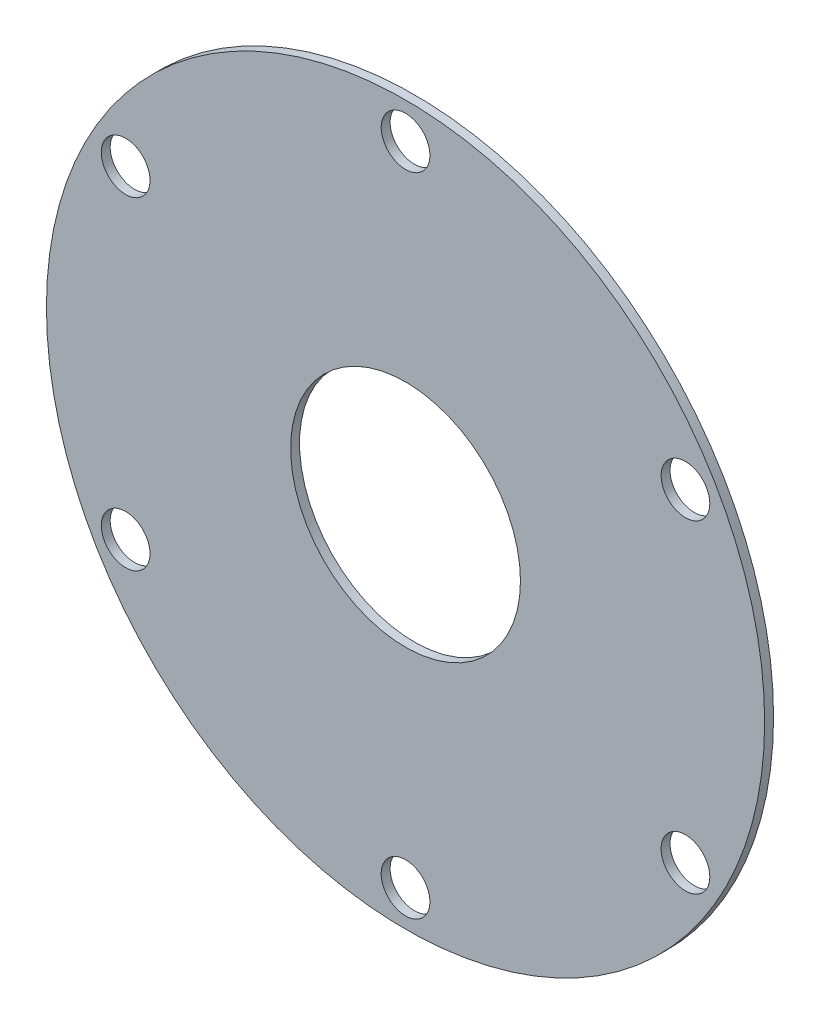
ISO-10303-21;
HEADER;
FILE_DESCRIPTION(('STEP AP214'),'2;1');
FILE_NAME('part.step','',(''),(''),'','','');
FILE_SCHEMA(('AUTOMOTIVE_DESIGN { 1 0 10303 214 1 1 1 1 }'));
ENDSEC;
DATA;
#1=APPLICATION_CONTEXT('core data for automotive mechanical design processes');
#2=APPLICATION_PROTOCOL_DEFINITION('international standard','automotive_design',2000,#1);
#3=PRODUCT_CONTEXT('',#1,'mechanical');
#4=PRODUCT('Part','Part','',(#3));
#5=PRODUCT_RELATED_PRODUCT_CATEGORY('part','',(#4));
#6=PRODUCT_DEFINITION_FORMATION('','',#4);
#7=PRODUCT_DEFINITION_CONTEXT('part definition',#1,'design');
#8=PRODUCT_DEFINITION('design','',#6,#7);
#9=PRODUCT_DEFINITION_SHAPE('','',#8);
#10=(LENGTH_UNIT() NAMED_UNIT(*) SI_UNIT(.MILLI.,.METRE.));
#11=(NAMED_UNIT(*) PLANE_ANGLE_UNIT() SI_UNIT($,.RADIAN.));
#12=(NAMED_UNIT(*) SI_UNIT($,.STERADIAN.) SOLID_ANGLE_UNIT());
#13=UNCERTAINTY_MEASURE_WITH_UNIT(LENGTH_MEASURE(1.E-05),#10,'distance_accuracy_value','');
#14=(GEOMETRIC_REPRESENTATION_CONTEXT(3) GLOBAL_UNCERTAINTY_ASSIGNED_CONTEXT((#13)) GLOBAL_UNIT_ASSIGNED_CONTEXT((#10,
#11,#12)) REPRESENTATION_CONTEXT('',''));
#15=CARTESIAN_POINT('',(0.,0.,0.));
#16=DIRECTION('',(0.,0.,1.));
#17=DIRECTION('',(1.,0.,0.));
#18=AXIS2_PLACEMENT_3D('',#15,#16,#17);
#19=CARTESIAN_POINT('',(0.,0.,0.7874));
#20=DIRECTION('',(0.,0.,1.));
#21=DIRECTION('',(1.,0.,0.));
#22=AXIS2_PLACEMENT_3D('',#19,#20,#21);
#23=PLANE('',#22);
#24=CARTESIAN_POINT('',(0.,28.575,0.787400000000001));
#25=DIRECTION('',(0.,0.,1.));
#26=DIRECTION('',(1.,0.,0.));
#27=AXIS2_PLACEMENT_3D('',#24,#25,#26);
#28=CIRCLE('',#27,2.15264999999999);
#29=CARTESIAN_POINT('',(2.15264999999999,28.575,0.787400000000001));
#30=VERTEX_POINT('',#29);
#31=EDGE_CURVE('E81',#30,#30,#28,.T.);
#32=ORIENTED_EDGE('',*,*,#31,.F.);
#33=EDGE_LOOP('',(#32));
#34=FACE_BOUND('',#33,.T.);
#35=CARTESIAN_POINT('',(24.7466759131404,14.2874999999999,0.787400000000001));
#36=DIRECTION('',(0.,0.,1.));
#37=DIRECTION('',(1.,0.,0.));
#38=AXIS2_PLACEMENT_3D('',#35,#36,#37);
#39=CIRCLE('',#38,2.15264999999999);
#40=CARTESIAN_POINT('',(26.8993259131404,14.2874999999999,0.787400000000001));
#41=VERTEX_POINT('',#40);
#42=EDGE_CURVE('E75',#41,#41,#39,.T.);
#43=ORIENTED_EDGE('',*,*,#42,.F.);
#44=EDGE_LOOP('',(#43));
#45=FACE_BOUND('',#44,.T.);
#46=CARTESIAN_POINT('',(24.7466759131403,-14.2875000000001,0.787400000000001));
#47=DIRECTION('',(0.,0.,1.));
#48=DIRECTION('',(1.,0.,0.));
#49=AXIS2_PLACEMENT_3D('',#46,#47,#48);
#50=CIRCLE('',#49,2.15264999999999);
#51=CARTESIAN_POINT('',(26.8993259131403,-14.2875000000001,0.787400000000001));
#52=VERTEX_POINT('',#51);
#53=EDGE_CURVE('E69',#52,#52,#50,.T.);
#54=ORIENTED_EDGE('',*,*,#53,.F.);
#55=EDGE_LOOP('',(#54));
#56=FACE_BOUND('',#55,.T.);
#57=CARTESIAN_POINT('',(-1.99538274087401E-13,-28.575,0.787400000000001));
#58=DIRECTION('',(0.,0.,1.));
#59=DIRECTION('',(1.,0.,0.));
#60=AXIS2_PLACEMENT_3D('',#57,#58,#59);
#61=CIRCLE('',#60,2.15264999999999);
#62=CARTESIAN_POINT('',(2.15264999999979,-28.575,0.787400000000001));
#63=VERTEX_POINT('',#62);
#64=EDGE_CURVE('E63',#63,#63,#61,.T.);
#65=ORIENTED_EDGE('',*,*,#64,.F.);
#66=EDGE_LOOP('',(#65));
#67=FACE_BOUND('',#66,.T.);
#68=CARTESIAN_POINT('',(-24.7466759131405,-14.2874999999998,0.787400000000001));
#69=DIRECTION('',(0.,0.,1.));
#70=DIRECTION('',(1.,0.,0.));
#71=AXIS2_PLACEMENT_3D('',#68,#69,#70);
#72=CIRCLE('',#71,2.15264999999999);
#73=CARTESIAN_POINT('',(-22.5940259131405,-14.2874999999998,0.787400000000001));
#74=VERTEX_POINT('',#73);
#75=EDGE_CURVE('E57',#74,#74,#72,.T.);
#76=ORIENTED_EDGE('',*,*,#75,.F.);
#77=EDGE_LOOP('',(#76));
#78=FACE_BOUND('',#77,.T.);
#79=CARTESIAN_POINT('',(-24.7466759131402,14.2875000000003,0.787400000000001));
#80=DIRECTION('',(0.,0.,1.));
#81=DIRECTION('',(1.,0.,0.));
#82=AXIS2_PLACEMENT_3D('',#79,#80,#81);
#83=CIRCLE('',#82,2.15264999999999);
#84=CARTESIAN_POINT('',(-22.5940259131402,14.2875000000003,0.787400000000001));
#85=VERTEX_POINT('',#84);
#86=EDGE_CURVE('E51',#85,#85,#83,.T.);
#87=ORIENTED_EDGE('',*,*,#86,.F.);
#88=EDGE_LOOP('',(#87));
#89=FACE_BOUND('',#88,.T.);
#90=CARTESIAN_POINT('',(0.,0.,0.7874));
#91=DIRECTION('',(0.,0.,1.));
#92=DIRECTION('',(1.,0.,0.));
#93=AXIS2_PLACEMENT_3D('',#90,#91,#92);
#94=CIRCLE('',#93,31.75);
#95=CARTESIAN_POINT('',(31.75,0.,0.7874));
#96=VERTEX_POINT('',#95);
#97=EDGE_CURVE('E10',#96,#96,#94,.T.);
#98=ORIENTED_EDGE('',*,*,#97,.T.);
#99=EDGE_LOOP('',(#98));
#100=FACE_BOUND('',#99,.T.);
#101=CARTESIAN_POINT('',(0.,0.,0.7874));
#102=DIRECTION('',(0.,0.,1.));
#103=DIRECTION('',(1.,0.,0.));
#104=AXIS2_PLACEMENT_3D('',#101,#102,#103);
#105=CIRCLE('',#104,10.16);
#106=CARTESIAN_POINT('',(10.16,0.,0.7874));
#107=VERTEX_POINT('',#106);
#108=EDGE_CURVE('E41',#107,#107,#105,.T.);
#109=ORIENTED_EDGE('',*,*,#108,.F.);
#110=EDGE_LOOP('',(#109));
#111=FACE_BOUND('',#110,.T.);
#112=ADVANCED_FACE('F30',(#34,#45,#56,#67,#78,#89,#100,#111),#23,.T.);
#113=CARTESIAN_POINT('',(0.,0.,0.));
#114=DIRECTION('',(0.,0.,1.));
#115=DIRECTION('',(1.,0.,0.));
#116=AXIS2_PLACEMENT_3D('',#113,#114,#115);
#117=PLANE('',#116);
#118=CARTESIAN_POINT('',(0.,28.575,0.));
#119=DIRECTION('',(0.,0.,1.));
#120=DIRECTION('',(1.,0.,0.));
#121=AXIS2_PLACEMENT_3D('',#118,#119,#120);
#122=CIRCLE('',#121,2.15265);
#123=CARTESIAN_POINT('',(2.15265,28.575,0.));
#124=VERTEX_POINT('',#123);
#125=EDGE_CURVE('E78',#124,#124,#122,.T.);
#126=ORIENTED_EDGE('',*,*,#125,.T.);
#127=EDGE_LOOP('',(#126));
#128=FACE_BOUND('',#127,.T.);
#129=CARTESIAN_POINT('',(24.7466759131404,14.2874999999999,0.));
#130=DIRECTION('',(0.,0.,1.));
#131=DIRECTION('',(1.,0.,0.));
#132=AXIS2_PLACEMENT_3D('',#129,#130,#131);
#133=CIRCLE('',#132,2.15265);
#134=CARTESIAN_POINT('',(26.8993259131404,14.2874999999999,0.));
#135=VERTEX_POINT('',#134);
#136=EDGE_CURVE('E72',#135,#135,#133,.T.);
#137=ORIENTED_EDGE('',*,*,#136,.T.);
#138=EDGE_LOOP('',(#137));
#139=FACE_BOUND('',#138,.T.);
#140=CARTESIAN_POINT('',(24.7466759131403,-14.2875000000001,0.));
#141=DIRECTION('',(0.,0.,1.));
#142=DIRECTION('',(1.,0.,0.));
#143=AXIS2_PLACEMENT_3D('',#140,#141,#142);
#144=CIRCLE('',#143,2.15265);
#145=CARTESIAN_POINT('',(26.8993259131403,-14.2875000000001,0.));
#146=VERTEX_POINT('',#145);
#147=EDGE_CURVE('E66',#146,#146,#144,.T.);
#148=ORIENTED_EDGE('',*,*,#147,.T.);
#149=EDGE_LOOP('',(#148));
#150=FACE_BOUND('',#149,.T.);
#151=CARTESIAN_POINT('',(-1.99538274087401E-13,-28.575,0.));
#152=DIRECTION('',(0.,0.,1.));
#153=DIRECTION('',(1.,0.,0.));
#154=AXIS2_PLACEMENT_3D('',#151,#152,#153);
#155=CIRCLE('',#154,2.15265);
#156=CARTESIAN_POINT('',(2.1526499999998,-28.575,0.));
#157=VERTEX_POINT('',#156);
#158=EDGE_CURVE('E60',#157,#157,#155,.T.);
#159=ORIENTED_EDGE('',*,*,#158,.T.);
#160=EDGE_LOOP('',(#159));
#161=FACE_BOUND('',#160,.T.);
#162=CARTESIAN_POINT('',(-24.7466759131405,-14.2874999999998,0.));
#163=DIRECTION('',(0.,0.,1.));
#164=DIRECTION('',(1.,0.,0.));
#165=AXIS2_PLACEMENT_3D('',#162,#163,#164);
#166=CIRCLE('',#165,2.15265);
#167=CARTESIAN_POINT('',(-22.5940259131405,-14.2874999999998,0.));
#168=VERTEX_POINT('',#167);
#169=EDGE_CURVE('E54',#168,#168,#166,.T.);
#170=ORIENTED_EDGE('',*,*,#169,.T.);
#171=EDGE_LOOP('',(#170));
#172=FACE_BOUND('',#171,.T.);
#173=CARTESIAN_POINT('',(-24.7466759131402,14.2875000000003,0.));
#174=DIRECTION('',(0.,0.,1.));
#175=DIRECTION('',(1.,0.,0.));
#176=AXIS2_PLACEMENT_3D('',#173,#174,#175);
#177=CIRCLE('',#176,2.15265);
#178=CARTESIAN_POINT('',(-22.5940259131402,14.2875000000003,0.));
#179=VERTEX_POINT('',#178);
#180=EDGE_CURVE('E46',#179,#179,#177,.T.);
#181=ORIENTED_EDGE('',*,*,#180,.T.);
#182=EDGE_LOOP('',(#181));
#183=FACE_BOUND('',#182,.T.);
#184=CARTESIAN_POINT('',(0.,0.,0.));
#185=DIRECTION('',(0.,0.,1.));
#186=DIRECTION('',(1.,0.,0.));
#187=AXIS2_PLACEMENT_3D('',#184,#185,#186);
#188=CIRCLE('',#187,31.75);
#189=CARTESIAN_POINT('',(31.75,0.,0.));
#190=VERTEX_POINT('',#189);
#191=EDGE_CURVE('E34',#190,#190,#188,.T.);
#192=ORIENTED_EDGE('',*,*,#191,.F.);
#193=EDGE_LOOP('',(#192));
#194=FACE_BOUND('',#193,.T.);
#195=CARTESIAN_POINT('',(0.,0.,0.));
#196=DIRECTION('',(0.,0.,1.));
#197=DIRECTION('',(1.,0.,0.));
#198=AXIS2_PLACEMENT_3D('',#195,#196,#197);
#199=CIRCLE('',#198,10.16);
#200=CARTESIAN_POINT('',(10.16,0.,0.));
#201=VERTEX_POINT('',#200);
#202=EDGE_CURVE('E43',#201,#201,#199,.T.);
#203=ORIENTED_EDGE('',*,*,#202,.T.);
#204=EDGE_LOOP('',(#203));
#205=FACE_BOUND('',#204,.T.);
#206=ADVANCED_FACE('F89',(#128,#139,#150,#161,#172,#183,#194,#205),#117,.F.);
#207=CARTESIAN_POINT('',(0.,0.,0.7874));
#208=DIRECTION('',(0.,0.,-1.));
#209=DIRECTION('',(-1.,0.,0.));
#210=AXIS2_PLACEMENT_3D('',#207,#208,#209);
#211=CYLINDRICAL_SURFACE('',#210,31.75);
#212=ORIENTED_EDGE('',*,*,#97,.F.);
#213=EDGE_LOOP('',(#212));
#214=FACE_BOUND('',#213,.T.);
#215=ORIENTED_EDGE('',*,*,#191,.T.);
#216=EDGE_LOOP('',(#215));
#217=FACE_BOUND('',#216,.T.);
#218=ADVANCED_FACE('F32',(#214,#217),#211,.T.);
#219=CARTESIAN_POINT('',(0.,0.,0.7874));
#220=DIRECTION('',(0.,0.,-1.));
#221=DIRECTION('',(-1.,0.,0.));
#222=AXIS2_PLACEMENT_3D('',#219,#220,#221);
#223=CYLINDRICAL_SURFACE('',#222,10.16);
#224=ORIENTED_EDGE('',*,*,#108,.T.);
#225=EDGE_LOOP('',(#224));
#226=FACE_BOUND('',#225,.T.);
#227=ORIENTED_EDGE('',*,*,#202,.F.);
#228=EDGE_LOOP('',(#227));
#229=FACE_BOUND('',#228,.T.);
#230=ADVANCED_FACE('F103',(#226,#229),#223,.F.);
#231=CARTESIAN_POINT('',(-24.7466759131402,14.2875000000003,0.7874));
#232=DIRECTION('',(0.,0.,1.));
#233=DIRECTION('',(1.,0.,0.));
#234=AXIS2_PLACEMENT_3D('',#231,#232,#233);
#235=CYLINDRICAL_SURFACE('',#234,2.15264999999999);
#236=ORIENTED_EDGE('',*,*,#180,.F.);
#237=EDGE_LOOP('',(#236));
#238=FACE_BOUND('',#237,.T.);
#239=ORIENTED_EDGE('',*,*,#86,.T.);
#240=EDGE_LOOP('',(#239));
#241=FACE_BOUND('',#240,.T.);
#242=ADVANCED_FACE('F106',(#238,#241),#235,.F.);
#243=CARTESIAN_POINT('',(-24.7466759131405,-14.2874999999998,0.7874));
#244=DIRECTION('',(0.,0.,1.));
#245=DIRECTION('',(1.,0.,0.));
#246=AXIS2_PLACEMENT_3D('',#243,#244,#245);
#247=CYLINDRICAL_SURFACE('',#246,2.15264999999999);
#248=ORIENTED_EDGE('',*,*,#169,.F.);
#249=EDGE_LOOP('',(#248));
#250=FACE_BOUND('',#249,.T.);
#251=ORIENTED_EDGE('',*,*,#75,.T.);
#252=EDGE_LOOP('',(#251));
#253=FACE_BOUND('',#252,.T.);
#254=ADVANCED_FACE('F120',(#250,#253),#247,.F.);
#255=CARTESIAN_POINT('',(-1.99538274087401E-13,-28.575,0.7874));
#256=DIRECTION('',(0.,0.,1.));
#257=DIRECTION('',(1.,0.,0.));
#258=AXIS2_PLACEMENT_3D('',#255,#256,#257);
#259=CYLINDRICAL_SURFACE('',#258,2.15264999999999);
#260=ORIENTED_EDGE('',*,*,#158,.F.);
#261=EDGE_LOOP('',(#260));
#262=FACE_BOUND('',#261,.T.);
#263=ORIENTED_EDGE('',*,*,#64,.T.);
#264=EDGE_LOOP('',(#263));
#265=FACE_BOUND('',#264,.T.);
#266=ADVANCED_FACE('F124',(#262,#265),#259,.F.);
#267=CARTESIAN_POINT('',(24.7466759131403,-14.2875000000001,0.7874));
#268=DIRECTION('',(0.,0.,1.));
#269=DIRECTION('',(1.,0.,0.));
#270=AXIS2_PLACEMENT_3D('',#267,#268,#269);
#271=CYLINDRICAL_SURFACE('',#270,2.15264999999999);
#272=ORIENTED_EDGE('',*,*,#147,.F.);
#273=EDGE_LOOP('',(#272));
#274=FACE_BOUND('',#273,.T.);
#275=ORIENTED_EDGE('',*,*,#53,.T.);
#276=EDGE_LOOP('',(#275));
#277=FACE_BOUND('',#276,.T.);
#278=ADVANCED_FACE('F128',(#274,#277),#271,.F.);
#279=CARTESIAN_POINT('',(24.7466759131404,14.2874999999999,0.7874));
#280=DIRECTION('',(0.,0.,1.));
#281=DIRECTION('',(1.,0.,0.));
#282=AXIS2_PLACEMENT_3D('',#279,#280,#281);
#283=CYLINDRICAL_SURFACE('',#282,2.15264999999999);
#284=ORIENTED_EDGE('',*,*,#136,.F.);
#285=EDGE_LOOP('',(#284));
#286=FACE_BOUND('',#285,.T.);
#287=ORIENTED_EDGE('',*,*,#42,.T.);
#288=EDGE_LOOP('',(#287));
#289=FACE_BOUND('',#288,.T.);
#290=ADVANCED_FACE('F132',(#286,#289),#283,.F.);
#291=CARTESIAN_POINT('',(0.,28.575,0.7874));
#292=DIRECTION('',(0.,0.,1.));
#293=DIRECTION('',(1.,0.,0.));
#294=AXIS2_PLACEMENT_3D('',#291,#292,#293);
#295=CYLINDRICAL_SURFACE('',#294,2.15264999999999);
#296=ORIENTED_EDGE('',*,*,#125,.F.);
#297=EDGE_LOOP('',(#296));
#298=FACE_BOUND('',#297,.T.);
#299=ORIENTED_EDGE('',*,*,#31,.T.);
#300=EDGE_LOOP('',(#299));
#301=FACE_BOUND('',#300,.T.);
#302=ADVANCED_FACE('F85',(#298,#301),#295,.F.);
#303=CLOSED_SHELL('',(#112,#206,#218,#230,#242,#254,#266,#278,#290,#302));
#304=MANIFOLD_SOLID_BREP('B2',#303);
#305=ADVANCED_BREP_SHAPE_REPRESENTATION('',(#18,#304),#14);
#306=SHAPE_DEFINITION_REPRESENTATION(#9,#305);
ENDSEC;
END-ISO-10303-21;
